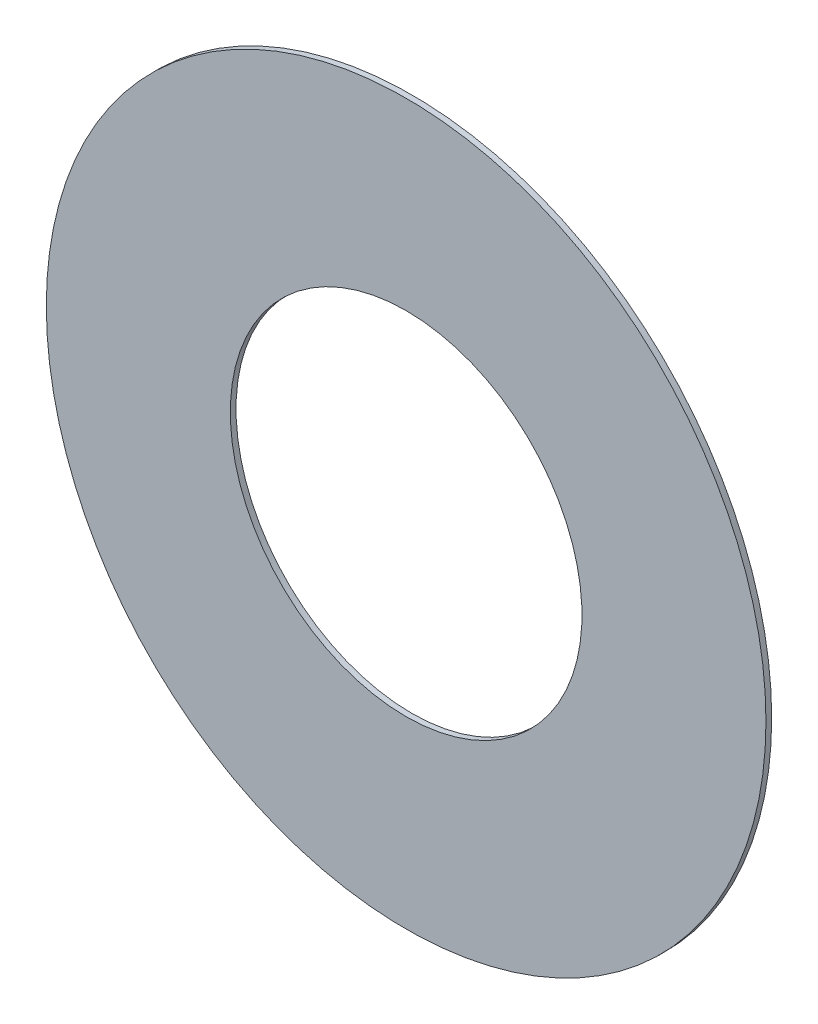
ISO-10303-21;
HEADER;
FILE_DESCRIPTION(('STEP AP214'),'2;1');
FILE_NAME('part.step','',(''),(''),'','','');
FILE_SCHEMA(('AUTOMOTIVE_DESIGN { 1 0 10303 214 1 1 1 1 }'));
ENDSEC;
DATA;
#1=APPLICATION_CONTEXT('core data for automotive mechanical design processes');
#2=APPLICATION_PROTOCOL_DEFINITION('international standard','automotive_design',2000,#1);
#3=PRODUCT_CONTEXT('',#1,'mechanical');
#4=PRODUCT('Part','Part','',(#3));
#5=PRODUCT_RELATED_PRODUCT_CATEGORY('part','',(#4));
#6=PRODUCT_DEFINITION_FORMATION('','',#4);
#7=PRODUCT_DEFINITION_CONTEXT('part definition',#1,'design');
#8=PRODUCT_DEFINITION('design','',#6,#7);
#9=PRODUCT_DEFINITION_SHAPE('','',#8);
#10=(LENGTH_UNIT() NAMED_UNIT(*) SI_UNIT(.MILLI.,.METRE.));
#11=(NAMED_UNIT(*) PLANE_ANGLE_UNIT() SI_UNIT($,.RADIAN.));
#12=(NAMED_UNIT(*) SI_UNIT($,.STERADIAN.) SOLID_ANGLE_UNIT());
#13=UNCERTAINTY_MEASURE_WITH_UNIT(LENGTH_MEASURE(1.E-05),#10,'distance_accuracy_value','');
#14=(GEOMETRIC_REPRESENTATION_CONTEXT(3) GLOBAL_UNCERTAINTY_ASSIGNED_CONTEXT((#13)) GLOBAL_UNIT_ASSIGNED_CONTEXT((#10,
#11,#12)) REPRESENTATION_CONTEXT('',''));
#15=CARTESIAN_POINT('',(0.,0.,0.));
#16=DIRECTION('',(0.,0.,1.));
#17=DIRECTION('',(1.,0.,0.));
#18=AXIS2_PLACEMENT_3D('',#15,#16,#17);
#19=CARTESIAN_POINT('',(78.5,-140.5,-0.045));
#20=DIRECTION('',(0.,0.,-1.));
#21=DIRECTION('',(0.,-1.,0.));
#22=AXIS2_PLACEMENT_3D('',#19,#20,#21);
#23=CYLINDRICAL_SURFACE('',#22,1.075);
#24=CARTESIAN_POINT('',(78.5,-140.5,-0.035));
#25=DIRECTION('',(0.,0.,-1.));
#26=DIRECTION('',(0.,-1.,0.));
#27=AXIS2_PLACEMENT_3D('',#24,#25,#26);
#28=CIRCLE('',#27,1.075);
#29=CARTESIAN_POINT('',(78.5,-141.575,-0.035));
#30=VERTEX_POINT('',#29);
#31=EDGE_CURVE('E25',#30,#30,#28,.T.);
#32=ORIENTED_EDGE('',*,*,#31,.T.);
#33=DIRECTION('',(0.,0.,1.));
#34=VECTOR('',#33,1.);
#35=CARTESIAN_POINT('',(78.5,-141.575,-0.045));
#36=LINE('',#35,#34);
#37=CARTESIAN_POINT('',(78.5,-141.575,0.));
#38=VERTEX_POINT('',#37);
#39=EDGE_CURVE('E11',#30,#38,#36,.T.);
#40=ORIENTED_EDGE('',*,*,#39,.T.);
#41=CARTESIAN_POINT('',(78.5,-140.5,0.));
#42=DIRECTION('',(0.,0.,-1.));
#43=DIRECTION('',(0.,-1.,0.));
#44=AXIS2_PLACEMENT_3D('',#41,#42,#43);
#45=CIRCLE('',#44,1.075);
#46=EDGE_CURVE('E69',#38,#38,#45,.T.);
#47=ORIENTED_EDGE('',*,*,#46,.F.);
#48=ORIENTED_EDGE('',*,*,#39,.F.);
#49=EDGE_LOOP('',(#32,#40,#47,#48));
#50=FACE_BOUND('',#49,.T.);
#51=ADVANCED_FACE('F17',(#50),#23,.F.);
#52=CARTESIAN_POINT('',(78.5,-140.5,-0.035));
#53=DIRECTION('',(0.,0.,1.));
#54=DIRECTION('',(1.,0.,0.));
#55=AXIS2_PLACEMENT_3D('',#52,#53,#54);
#56=PLANE('',#55);
#57=ORIENTED_EDGE('',*,*,#31,.F.);
#58=EDGE_LOOP('',(#57));
#59=FACE_BOUND('',#58,.T.);
#60=CARTESIAN_POINT('',(78.5,-140.5,-0.035));
#61=DIRECTION('',(0.,0.,1.));
#62=DIRECTION('',(1.,0.,0.));
#63=AXIS2_PLACEMENT_3D('',#60,#61,#62);
#64=CIRCLE('',#63,2.2);
#65=CARTESIAN_POINT('',(80.7,-140.5,-0.035));
#66=VERTEX_POINT('',#65);
#67=EDGE_CURVE('E56',#66,#66,#64,.T.);
#68=ORIENTED_EDGE('',*,*,#67,.F.);
#69=EDGE_LOOP('',(#68));
#70=FACE_BOUND('',#69,.T.);
#71=ADVANCED_FACE('F77',(#59,#70),#56,.F.);
#72=CARTESIAN_POINT('',(78.5,-140.5,0.));
#73=DIRECTION('',(0.,0.,1.));
#74=DIRECTION('',(1.,0.,0.));
#75=AXIS2_PLACEMENT_3D('',#72,#73,#74);
#76=PLANE('',#75);
#77=ORIENTED_EDGE('',*,*,#46,.T.);
#78=EDGE_LOOP('',(#77));
#79=FACE_BOUND('',#78,.T.);
#80=CARTESIAN_POINT('',(78.5,-140.5,0.));
#81=DIRECTION('',(0.,0.,1.));
#82=DIRECTION('',(1.,0.,0.));
#83=AXIS2_PLACEMENT_3D('',#80,#81,#82);
#84=CIRCLE('',#83,2.2);
#85=CARTESIAN_POINT('',(80.7,-140.5,0.));
#86=VERTEX_POINT('',#85);
#87=EDGE_CURVE('E54',#86,#86,#84,.T.);
#88=ORIENTED_EDGE('',*,*,#87,.T.);
#89=EDGE_LOOP('',(#88));
#90=FACE_BOUND('',#89,.T.);
#91=ADVANCED_FACE('F60',(#79,#90),#76,.T.);
#92=CARTESIAN_POINT('',(78.5,-140.5,-0.035));
#93=DIRECTION('',(0.,0.,1.));
#94=DIRECTION('',(1.,0.,0.));
#95=AXIS2_PLACEMENT_3D('',#92,#93,#94);
#96=CYLINDRICAL_SURFACE('',#95,2.2);
#97=ORIENTED_EDGE('',*,*,#87,.F.);
#98=DIRECTION('',(0.,0.,1.));
#99=VECTOR('',#98,1.);
#100=CARTESIAN_POINT('',(80.7,-140.5,-0.035));
#101=LINE('',#100,#99);
#102=EDGE_CURVE('E51',#66,#86,#101,.T.);
#103=ORIENTED_EDGE('',*,*,#102,.F.);
#104=ORIENTED_EDGE('',*,*,#67,.T.);
#105=ORIENTED_EDGE('',*,*,#102,.T.);
#106=EDGE_LOOP('',(#97,#103,#104,#105));
#107=FACE_BOUND('',#106,.T.);
#108=ADVANCED_FACE('F53',(#107),#96,.T.);
#109=CLOSED_SHELL('',(#51,#71,#91,#108));
#110=MANIFOLD_SOLID_BREP('B1',#109);
#111=ADVANCED_BREP_SHAPE_REPRESENTATION('',(#18,#110),#14);
#112=SHAPE_DEFINITION_REPRESENTATION(#9,#111);
ENDSEC;
END-ISO-10303-21;
